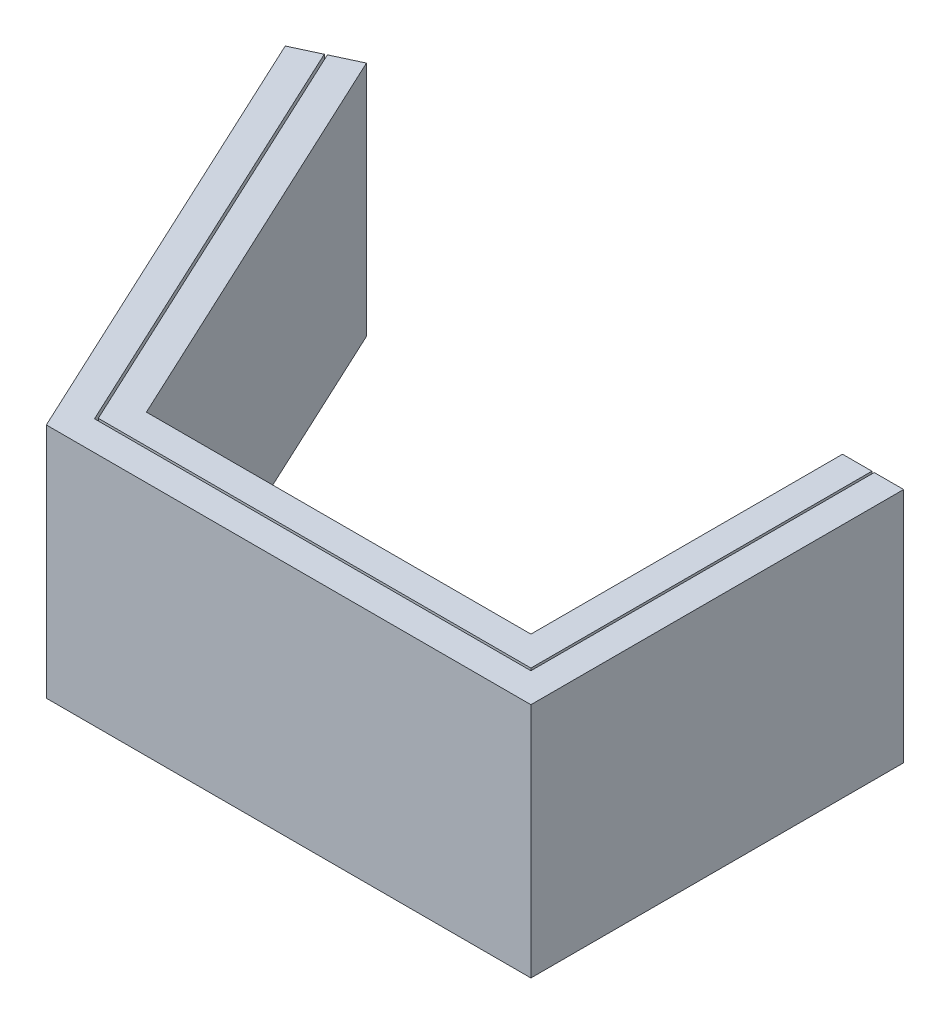
ISO-10303-21;
HEADER;
FILE_DESCRIPTION(('STEP AP214'),'2;1');
FILE_NAME('part.step','',(''),(''),'','','');
FILE_SCHEMA(('AUTOMOTIVE_DESIGN { 1 0 10303 214 1 1 1 1 }'));
ENDSEC;
DATA;
#1=APPLICATION_CONTEXT('core data for automotive mechanical design processes');
#2=APPLICATION_PROTOCOL_DEFINITION('international standard','automotive_design',2000,#1);
#3=PRODUCT_CONTEXT('',#1,'mechanical');
#4=PRODUCT('Part','Part','',(#3));
#5=PRODUCT_RELATED_PRODUCT_CATEGORY('part','',(#4));
#6=PRODUCT_DEFINITION_FORMATION('','',#4);
#7=PRODUCT_DEFINITION_CONTEXT('part definition',#1,'design');
#8=PRODUCT_DEFINITION('design','',#6,#7);
#9=PRODUCT_DEFINITION_SHAPE('','',#8);
#10=(LENGTH_UNIT() NAMED_UNIT(*) SI_UNIT(.MILLI.,.METRE.));
#11=(NAMED_UNIT(*) PLANE_ANGLE_UNIT() SI_UNIT($,.RADIAN.));
#12=(NAMED_UNIT(*) SI_UNIT($,.STERADIAN.) SOLID_ANGLE_UNIT());
#13=UNCERTAINTY_MEASURE_WITH_UNIT(LENGTH_MEASURE(1.E-05),#10,'distance_accuracy_value','');
#14=(GEOMETRIC_REPRESENTATION_CONTEXT(3) GLOBAL_UNCERTAINTY_ASSIGNED_CONTEXT((#13)) GLOBAL_UNIT_ASSIGNED_CONTEXT((#10,
#11,#12)) REPRESENTATION_CONTEXT('',''));
#15=CARTESIAN_POINT('',(0.,0.,0.));
#16=DIRECTION('',(0.,0.,1.));
#17=DIRECTION('',(1.,0.,0.));
#18=AXIS2_PLACEMENT_3D('',#15,#16,#17);
#19=CARTESIAN_POINT('',(-142.625579714794,0.,-98.9466557883392));
#20=DIRECTION('',(-0.422618261740698,0.,-0.906307787036651));
#21=DIRECTION('',(-0.906307787036651,0.,0.422618261740698));
#22=AXIS2_PLACEMENT_3D('',#19,#20,#21);
#23=PLANE('',#22);
#24=DIRECTION('',(-0.906307787036651,0.,0.422618261740698));
#25=VECTOR('',#24,1.);
#26=CARTESIAN_POINT('',(-142.625579714794,50.8,-98.9466557883392));
#27=LINE('',#26,#25);
#28=CARTESIAN_POINT('',(-136.906777578593,50.8,-101.613377019923));
#29=VERTEX_POINT('',#28);
#30=CARTESIAN_POINT('',(-142.625579714794,50.8,-98.9466557883392));
#31=VERTEX_POINT('',#30);
#32=EDGE_CURVE('E148',#29,#31,#27,.T.);
#33=ORIENTED_EDGE('',*,*,#32,.F.);
#34=DIRECTION('',(0.,1.,0.));
#35=VECTOR('',#34,1.);
#36=CARTESIAN_POINT('',(-136.906777578593,0.,-101.613377019923));
#37=LINE('',#36,#35);
#38=CARTESIAN_POINT('',(-136.906777578593,0.,-101.613377019923));
#39=VERTEX_POINT('',#38);
#40=EDGE_CURVE('E13',#39,#29,#37,.T.);
#41=ORIENTED_EDGE('',*,*,#40,.F.);
#42=DIRECTION('',(-0.906307787036651,0.,0.422618261740698));
#43=VECTOR('',#42,1.);
#44=CARTESIAN_POINT('',(-142.625579714794,0.,-98.9466557883392));
#45=LINE('',#44,#43);
#46=CARTESIAN_POINT('',(-142.625579714794,0.,-98.9466557883392));
#47=VERTEX_POINT('',#46);
#48=EDGE_CURVE('E186',#39,#47,#45,.T.);
#49=ORIENTED_EDGE('',*,*,#48,.T.);
#50=DIRECTION('',(0.,1.,0.));
#51=VECTOR('',#50,1.);
#52=CARTESIAN_POINT('',(-142.625579714794,0.,-98.9466557883392));
#53=LINE('',#52,#51);
#54=EDGE_CURVE('E54',#47,#31,#53,.T.);
#55=ORIENTED_EDGE('',*,*,#54,.T.);
#56=EDGE_LOOP('',(#33,#41,#49,#55));
#57=FACE_BOUND('',#56,.T.);
#58=ADVANCED_FACE('F51',(#57),#23,.T.);
#59=CARTESIAN_POINT('',(-136.906777578593,0.,-101.613377019923));
#60=DIRECTION('',(0.906307787036651,0.,-0.422618261740697));
#61=DIRECTION('',(-0.422618261740697,0.,-0.906307787036651));
#62=AXIS2_PLACEMENT_3D('',#59,#60,#61);
#63=PLANE('',#62);
#64=DIRECTION('',(-0.422618261740697,0.,-0.906307787036651));
#65=VECTOR('',#64,1.);
#66=CARTESIAN_POINT('',(-136.906777578593,50.8,-101.613377019923));
#67=LINE('',#66,#65);
#68=CARTESIAN_POINT('',(-95.6416381782056,50.8,-13.12));
#69=VERTEX_POINT('',#68);
#70=EDGE_CURVE('E182',#69,#29,#67,.T.);
#71=ORIENTED_EDGE('',*,*,#70,.F.);
#72=DIRECTION('',(0.,1.,0.));
#73=VECTOR('',#72,1.);
#74=CARTESIAN_POINT('',(-95.6416381782056,0.,-13.12));
#75=LINE('',#74,#73);
#76=CARTESIAN_POINT('',(-95.6416381782056,0.,-13.12));
#77=VERTEX_POINT('',#76);
#78=EDGE_CURVE('E60',#77,#69,#75,.T.);
#79=ORIENTED_EDGE('',*,*,#78,.F.);
#80=DIRECTION('',(-0.422618261740697,0.,-0.906307787036651));
#81=VECTOR('',#80,1.);
#82=CARTESIAN_POINT('',(-136.906777578593,0.,-101.613377019923));
#83=LINE('',#82,#81);
#84=EDGE_CURVE('E138',#77,#39,#83,.T.);
#85=ORIENTED_EDGE('',*,*,#84,.T.);
#86=ORIENTED_EDGE('',*,*,#40,.T.);
#87=EDGE_LOOP('',(#71,#79,#85,#86));
#88=FACE_BOUND('',#87,.T.);
#89=ADVANCED_FACE('F200',(#88),#63,.T.);
#90=CARTESIAN_POINT('',(-95.6416381782056,0.,-13.12));
#91=DIRECTION('',(0.,0.,-1.));
#92=DIRECTION('',(-1.,0.,0.));
#93=AXIS2_PLACEMENT_3D('',#90,#91,#92);
#94=PLANE('',#93);
#95=DIRECTION('',(-1.,0.,0.));
#96=VECTOR('',#95,1.);
#97=CARTESIAN_POINT('',(-95.6416381782056,50.8,-13.12));
#98=LINE('',#97,#96);
#99=CARTESIAN_POINT('',(-13.12,50.8,-13.12));
#100=VERTEX_POINT('',#99);
#101=EDGE_CURVE('E125',#100,#69,#98,.T.);
#102=ORIENTED_EDGE('',*,*,#101,.F.);
#103=DIRECTION('',(0.,1.,0.));
#104=VECTOR('',#103,1.);
#105=CARTESIAN_POINT('',(-13.12,0.,-13.12));
#106=LINE('',#105,#104);
#107=CARTESIAN_POINT('',(-13.12,0.,-13.12));
#108=VERTEX_POINT('',#107);
#109=EDGE_CURVE('E120',#108,#100,#106,.T.);
#110=ORIENTED_EDGE('',*,*,#109,.F.);
#111=DIRECTION('',(-1.,0.,0.));
#112=VECTOR('',#111,1.);
#113=CARTESIAN_POINT('',(-95.6416381782056,0.,-13.12));
#114=LINE('',#113,#112);
#115=EDGE_CURVE('E123',#108,#77,#114,.T.);
#116=ORIENTED_EDGE('',*,*,#115,.T.);
#117=ORIENTED_EDGE('',*,*,#78,.T.);
#118=EDGE_LOOP('',(#102,#110,#116,#117));
#119=FACE_BOUND('',#118,.T.);
#120=ADVANCED_FACE('F122',(#119),#94,.T.);
#121=CARTESIAN_POINT('',(-13.12,0.,-13.12));
#122=DIRECTION('',(-1.,0.,0.));
#123=DIRECTION('',(0.,0.,1.));
#124=AXIS2_PLACEMENT_3D('',#121,#122,#123);
#125=PLANE('',#124);
#126=DIRECTION('',(0.,0.,1.));
#127=VECTOR('',#126,1.);
#128=CARTESIAN_POINT('',(-13.12,50.8,-13.12));
#129=LINE('',#128,#127);
#130=CARTESIAN_POINT('',(-13.12,50.8,-80.));
#131=VERTEX_POINT('',#130);
#132=EDGE_CURVE('E176',#131,#100,#129,.T.);
#133=ORIENTED_EDGE('',*,*,#132,.F.);
#134=DIRECTION('',(0.,1.,0.));
#135=VECTOR('',#134,1.);
#136=CARTESIAN_POINT('',(-13.12,0.,-80.));
#137=LINE('',#136,#135);
#138=CARTESIAN_POINT('',(-13.12,0.,-80.));
#139=VERTEX_POINT('',#138);
#140=EDGE_CURVE('E130',#139,#131,#137,.T.);
#141=ORIENTED_EDGE('',*,*,#140,.F.);
#142=DIRECTION('',(0.,0.,1.));
#143=VECTOR('',#142,1.);
#144=CARTESIAN_POINT('',(-13.12,0.,-13.12));
#145=LINE('',#144,#143);
#146=EDGE_CURVE('E136',#139,#108,#145,.T.);
#147=ORIENTED_EDGE('',*,*,#146,.T.);
#148=ORIENTED_EDGE('',*,*,#109,.T.);
#149=EDGE_LOOP('',(#133,#141,#147,#148));
#150=FACE_BOUND('',#149,.T.);
#151=ADVANCED_FACE('F140',(#150),#125,.T.);
#152=CARTESIAN_POINT('',(-13.12,0.,-80.));
#153=DIRECTION('',(0.,0.,-1.));
#154=DIRECTION('',(-1.,0.,0.));
#155=AXIS2_PLACEMENT_3D('',#152,#153,#154);
#156=PLANE('',#155);
#157=DIRECTION('',(-1.,0.,0.));
#158=VECTOR('',#157,1.);
#159=CARTESIAN_POINT('',(-13.12,50.8,-80.));
#160=LINE('',#159,#158);
#161=CARTESIAN_POINT('',(-6.81,50.8,-80.));
#162=VERTEX_POINT('',#161);
#163=EDGE_CURVE('E171',#162,#131,#160,.T.);
#164=ORIENTED_EDGE('',*,*,#163,.F.);
#165=DIRECTION('',(0.,1.,0.));
#166=VECTOR('',#165,1.);
#167=CARTESIAN_POINT('',(-6.81,0.,-80.));
#168=LINE('',#167,#166);
#169=CARTESIAN_POINT('',(-6.81,0.,-80.));
#170=VERTEX_POINT('',#169);
#171=EDGE_CURVE('E190',#170,#162,#168,.T.);
#172=ORIENTED_EDGE('',*,*,#171,.F.);
#173=DIRECTION('',(-1.,0.,0.));
#174=VECTOR('',#173,1.);
#175=CARTESIAN_POINT('',(-13.12,0.,-80.));
#176=LINE('',#175,#174);
#177=EDGE_CURVE('E141',#170,#139,#176,.T.);
#178=ORIENTED_EDGE('',*,*,#177,.T.);
#179=ORIENTED_EDGE('',*,*,#140,.T.);
#180=EDGE_LOOP('',(#164,#172,#178,#179));
#181=FACE_BOUND('',#180,.T.);
#182=ADVANCED_FACE('F213',(#181),#156,.T.);
#183=CARTESIAN_POINT('',(-6.81,0.,-6.80999999999999));
#184=DIRECTION('',(1.,0.,0.));
#185=DIRECTION('',(0.,0.,-1.));
#186=AXIS2_PLACEMENT_3D('',#183,#184,#185);
#187=PLANE('',#186);
#188=DIRECTION('',(0.,0.,-1.));
#189=VECTOR('',#188,1.);
#190=CARTESIAN_POINT('',(-6.81,50.8,-6.80999999999999));
#191=LINE('',#190,#189);
#192=CARTESIAN_POINT('',(-6.81,50.8,-6.80999999999999));
#193=VERTEX_POINT('',#192);
#194=EDGE_CURVE('E166',#193,#162,#191,.T.);
#195=ORIENTED_EDGE('',*,*,#194,.F.);
#196=DIRECTION('',(0.,1.,0.));
#197=VECTOR('',#196,1.);
#198=CARTESIAN_POINT('',(-6.81,0.,-6.80999999999999));
#199=LINE('',#198,#197);
#200=CARTESIAN_POINT('',(-6.81,0.,-6.80999999999999));
#201=VERTEX_POINT('',#200);
#202=EDGE_CURVE('E192',#201,#193,#199,.T.);
#203=ORIENTED_EDGE('',*,*,#202,.F.);
#204=DIRECTION('',(0.,0.,-1.));
#205=VECTOR('',#204,1.);
#206=CARTESIAN_POINT('',(-6.81,0.,-6.80999999999999));
#207=LINE('',#206,#205);
#208=EDGE_CURVE('E143',#201,#170,#207,.T.);
#209=ORIENTED_EDGE('',*,*,#208,.T.);
#210=ORIENTED_EDGE('',*,*,#171,.T.);
#211=EDGE_LOOP('',(#195,#203,#209,#210));
#212=FACE_BOUND('',#211,.T.);
#213=ADVANCED_FACE('F216',(#212),#187,.T.);
#214=CARTESIAN_POINT('',(-99.6615515239009,0.,-6.80999999999999));
#215=DIRECTION('',(0.,0.,1.));
#216=DIRECTION('',(1.,0.,0.));
#217=AXIS2_PLACEMENT_3D('',#214,#215,#216);
#218=PLANE('',#217);
#219=DIRECTION('',(1.,0.,0.));
#220=VECTOR('',#219,1.);
#221=CARTESIAN_POINT('',(-99.6615515239009,50.8,-6.80999999999999));
#222=LINE('',#221,#220);
#223=CARTESIAN_POINT('',(-99.6615515239009,50.8,-6.80999999999999));
#224=VERTEX_POINT('',#223);
#225=EDGE_CURVE('E162',#224,#193,#222,.T.);
#226=ORIENTED_EDGE('',*,*,#225,.F.);
#227=DIRECTION('',(0.,1.,0.));
#228=VECTOR('',#227,1.);
#229=CARTESIAN_POINT('',(-99.6615515239009,0.,-6.80999999999999));
#230=LINE('',#229,#228);
#231=CARTESIAN_POINT('',(-99.6615515239009,0.,-6.80999999999999));
#232=VERTEX_POINT('',#231);
#233=EDGE_CURVE('E193',#232,#224,#230,.T.);
#234=ORIENTED_EDGE('',*,*,#233,.F.);
#235=DIRECTION('',(1.,0.,0.));
#236=VECTOR('',#235,1.);
#237=CARTESIAN_POINT('',(-99.6615515239009,0.,-6.80999999999999));
#238=LINE('',#237,#236);
#239=EDGE_CURVE('E292',#232,#201,#238,.T.);
#240=ORIENTED_EDGE('',*,*,#239,.T.);
#241=ORIENTED_EDGE('',*,*,#202,.T.);
#242=EDGE_LOOP('',(#226,#234,#240,#241));
#243=FACE_BOUND('',#242,.T.);
#244=ADVANCED_FACE('F220',(#243),#218,.T.);
#245=CARTESIAN_POINT('',(-142.625579714794,0.,-98.9466557883392));
#246=DIRECTION('',(-0.906307787036651,0.,0.422618261740697));
#247=DIRECTION('',(0.422618261740697,0.,0.906307787036651));
#248=AXIS2_PLACEMENT_3D('',#245,#246,#247);
#249=PLANE('',#248);
#250=DIRECTION('',(0.422618261740697,0.,0.906307787036651));
#251=VECTOR('',#250,1.);
#252=CARTESIAN_POINT('',(-142.625579714794,50.8,-98.9466557883392));
#253=LINE('',#252,#251);
#254=EDGE_CURVE('E153',#31,#224,#253,.T.);
#255=ORIENTED_EDGE('',*,*,#254,.F.);
#256=ORIENTED_EDGE('',*,*,#54,.F.);
#257=DIRECTION('',(0.422618261740697,0.,0.906307787036651));
#258=VECTOR('',#257,1.);
#259=CARTESIAN_POINT('',(-142.625579714794,0.,-98.9466557883392));
#260=LINE('',#259,#258);
#261=EDGE_CURVE('E293',#47,#232,#260,.T.);
#262=ORIENTED_EDGE('',*,*,#261,.T.);
#263=ORIENTED_EDGE('',*,*,#233,.T.);
#264=EDGE_LOOP('',(#255,#256,#262,#263));
#265=FACE_BOUND('',#264,.T.);
#266=ADVANCED_FACE('F196',(#265),#249,.T.);
#267=CARTESIAN_POINT('',(0.,0.,0.));
#268=DIRECTION('',(0.,-1.,0.));
#269=DIRECTION('',(0.,0.,-1.));
#270=AXIS2_PLACEMENT_3D('',#267,#268,#269);
#271=PLANE('',#270);
#272=ORIENTED_EDGE('',*,*,#48,.F.);
#273=ORIENTED_EDGE('',*,*,#84,.F.);
#274=ORIENTED_EDGE('',*,*,#115,.F.);
#275=ORIENTED_EDGE('',*,*,#146,.F.);
#276=ORIENTED_EDGE('',*,*,#177,.F.);
#277=ORIENTED_EDGE('',*,*,#208,.F.);
#278=ORIENTED_EDGE('',*,*,#239,.F.);
#279=ORIENTED_EDGE('',*,*,#261,.F.);
#280=EDGE_LOOP('',(#272,#273,#274,#275,#276,#277,#278,#279));
#281=FACE_BOUND('',#280,.T.);
#282=ADVANCED_FACE('F134',(#281),#271,.T.);
#283=CARTESIAN_POINT('',(0.,50.8,0.));
#284=DIRECTION('',(0.,-1.,0.));
#285=DIRECTION('',(0.,0.,-1.));
#286=AXIS2_PLACEMENT_3D('',#283,#284,#285);
#287=PLANE('',#286);
#288=ORIENTED_EDGE('',*,*,#32,.T.);
#289=ORIENTED_EDGE('',*,*,#254,.T.);
#290=ORIENTED_EDGE('',*,*,#225,.T.);
#291=ORIENTED_EDGE('',*,*,#194,.T.);
#292=ORIENTED_EDGE('',*,*,#163,.T.);
#293=ORIENTED_EDGE('',*,*,#132,.T.);
#294=ORIENTED_EDGE('',*,*,#101,.T.);
#295=ORIENTED_EDGE('',*,*,#70,.T.);
#296=EDGE_LOOP('',(#288,#289,#290,#291,#292,#293,#294,#295));
#297=FACE_BOUND('',#296,.T.);
#298=ADVANCED_FACE('F199',(#297),#287,.F.);
#299=CLOSED_SHELL('',(#58,#89,#120,#151,#182,#213,#244,#266,#282,#298));
#300=MANIFOLD_SOLID_BREP('B2',#299);
#301=CARTESIAN_POINT('',(0.,50.8,0.));
#302=DIRECTION('',(-1.,0.,0.));
#303=DIRECTION('',(0.,0.,1.));
#304=AXIS2_PLACEMENT_3D('',#301,#302,#303);
#305=PLANE('',#304);
#306=DIRECTION('',(0.,0.,-1.));
#307=VECTOR('',#306,1.);
#308=CARTESIAN_POINT('',(0.,0.,0.));
#309=LINE('',#308,#307);
#310=CARTESIAN_POINT('',(0.,0.,0.));
#311=VERTEX_POINT('',#310);
#312=CARTESIAN_POINT('',(0.,0.,-80.));
#313=VERTEX_POINT('',#312);
#314=EDGE_CURVE('E457',#311,#313,#309,.T.);
#315=ORIENTED_EDGE('',*,*,#314,.T.);
#316=DIRECTION('',(0.,-1.,0.));
#317=VECTOR('',#316,1.);
#318=CARTESIAN_POINT('',(0.,50.8,-80.));
#319=LINE('',#318,#317);
#320=CARTESIAN_POINT('',(0.,50.8,-80.));
#321=VERTEX_POINT('',#320);
#322=EDGE_CURVE('E49',#321,#313,#319,.T.);
#323=ORIENTED_EDGE('',*,*,#322,.F.);
#324=DIRECTION('',(0.,0.,-1.));
#325=VECTOR('',#324,1.);
#326=CARTESIAN_POINT('',(0.,50.8,0.));
#327=LINE('',#326,#325);
#328=CARTESIAN_POINT('',(0.,50.8,0.));
#329=VERTEX_POINT('',#328);
#330=EDGE_CURVE('E422',#329,#321,#327,.T.);
#331=ORIENTED_EDGE('',*,*,#330,.F.);
#332=DIRECTION('',(0.,-1.,0.));
#333=VECTOR('',#332,1.);
#334=CARTESIAN_POINT('',(0.,50.8,0.));
#335=LINE('',#334,#333);
#336=EDGE_CURVE('E397',#329,#311,#335,.T.);
#337=ORIENTED_EDGE('',*,*,#336,.T.);
#338=EDGE_LOOP('',(#315,#323,#331,#337));
#339=FACE_BOUND('',#338,.T.);
#340=ADVANCED_FACE('F302',(#339),#305,.F.);
#341=CARTESIAN_POINT('',(-6.31,50.8,-80.));
#342=DIRECTION('',(0.,0.,1.));
#343=DIRECTION('',(1.,0.,0.));
#344=AXIS2_PLACEMENT_3D('',#341,#342,#343);
#345=PLANE('',#344);
#346=DIRECTION('',(-1.,0.,0.));
#347=VECTOR('',#346,1.);
#348=CARTESIAN_POINT('',(-6.31,0.,-80.));
#349=LINE('',#348,#347);
#350=CARTESIAN_POINT('',(-6.31,0.,-80.));
#351=VERTEX_POINT('',#350);
#352=EDGE_CURVE('E451',#313,#351,#349,.T.);
#353=ORIENTED_EDGE('',*,*,#352,.T.);
#354=DIRECTION('',(0.,-1.,0.));
#355=VECTOR('',#354,1.);
#356=CARTESIAN_POINT('',(-6.31,50.8,-80.));
#357=LINE('',#356,#355);
#358=CARTESIAN_POINT('',(-6.31,50.8,-80.));
#359=VERTEX_POINT('',#358);
#360=EDGE_CURVE('E310',#359,#351,#357,.T.);
#361=ORIENTED_EDGE('',*,*,#360,.F.);
#362=DIRECTION('',(-1.,0.,0.));
#363=VECTOR('',#362,1.);
#364=CARTESIAN_POINT('',(-6.31,50.8,-80.));
#365=LINE('',#364,#363);
#366=EDGE_CURVE('E361',#321,#359,#365,.T.);
#367=ORIENTED_EDGE('',*,*,#366,.F.);
#368=ORIENTED_EDGE('',*,*,#322,.T.);
#369=EDGE_LOOP('',(#353,#361,#367,#368));
#370=FACE_BOUND('',#369,.T.);
#371=ADVANCED_FACE('F476',(#370),#345,.F.);
#372=CARTESIAN_POINT('',(-6.31,50.8,-6.31));
#373=DIRECTION('',(1.,0.,0.));
#374=DIRECTION('',(0.,0.,-1.));
#375=AXIS2_PLACEMENT_3D('',#372,#373,#374);
#376=PLANE('',#375);
#377=DIRECTION('',(0.,0.,1.));
#378=VECTOR('',#377,1.);
#379=CARTESIAN_POINT('',(-6.31,0.,-6.31));
#380=LINE('',#379,#378);
#381=CARTESIAN_POINT('',(-6.31,0.,-6.31));
#382=VERTEX_POINT('',#381);
#383=EDGE_CURVE('E446',#351,#382,#380,.T.);
#384=ORIENTED_EDGE('',*,*,#383,.T.);
#385=DIRECTION('',(0.,-1.,0.));
#386=VECTOR('',#385,1.);
#387=CARTESIAN_POINT('',(-6.31,50.8,-6.31));
#388=LINE('',#387,#386);
#389=CARTESIAN_POINT('',(-6.31,50.8,-6.31));
#390=VERTEX_POINT('',#389);
#391=EDGE_CURVE('E438',#390,#382,#388,.T.);
#392=ORIENTED_EDGE('',*,*,#391,.F.);
#393=DIRECTION('',(0.,0.,1.));
#394=VECTOR('',#393,1.);
#395=CARTESIAN_POINT('',(-6.31,50.8,-6.31));
#396=LINE('',#395,#394);
#397=EDGE_CURVE('E414',#359,#390,#396,.T.);
#398=ORIENTED_EDGE('',*,*,#397,.F.);
#399=ORIENTED_EDGE('',*,*,#360,.T.);
#400=EDGE_LOOP('',(#384,#392,#398,#399));
#401=FACE_BOUND('',#400,.T.);
#402=ADVANCED_FACE('F444',(#401),#376,.F.);
#403=CARTESIAN_POINT('',(-6.31,50.8,-6.31));
#404=DIRECTION('',(0.,0.,1.));
#405=DIRECTION('',(1.,0.,0.));
#406=AXIS2_PLACEMENT_3D('',#403,#404,#405);
#407=PLANE('',#406);
#408=DIRECTION('',(-1.,0.,0.));
#409=VECTOR('',#408,1.);
#410=CARTESIAN_POINT('',(-6.31,0.,-6.31));
#411=LINE('',#410,#409);
#412=CARTESIAN_POINT('',(-99.9800866543047,0.,-6.30999999999999));
#413=VERTEX_POINT('',#412);
#414=EDGE_CURVE('E453',#382,#413,#411,.T.);
#415=ORIENTED_EDGE('',*,*,#414,.T.);
#416=DIRECTION('',(0.,-1.,0.));
#417=VECTOR('',#416,1.);
#418=CARTESIAN_POINT('',(-99.9800866543047,50.8,-6.30999999999999));
#419=LINE('',#418,#417);
#420=CARTESIAN_POINT('',(-99.9800866543047,50.8,-6.30999999999999));
#421=VERTEX_POINT('',#420);
#422=EDGE_CURVE('E435',#421,#413,#419,.T.);
#423=ORIENTED_EDGE('',*,*,#422,.F.);
#424=DIRECTION('',(-1.,0.,0.));
#425=VECTOR('',#424,1.);
#426=CARTESIAN_POINT('',(-6.31,50.8,-6.31));
#427=LINE('',#426,#425);
#428=EDGE_CURVE('E410',#390,#421,#427,.T.);
#429=ORIENTED_EDGE('',*,*,#428,.F.);
#430=ORIENTED_EDGE('',*,*,#391,.T.);
#431=EDGE_LOOP('',(#415,#423,#429,#430));
#432=FACE_BOUND('',#431,.T.);
#433=ADVANCED_FACE('F483',(#432),#407,.F.);
#434=CARTESIAN_POINT('',(-99.9800866543047,50.8,-6.30999999999999));
#435=DIRECTION('',(-0.906307787036651,0.,0.422618261740697));
#436=DIRECTION('',(0.422618261740697,0.,0.906307787036651));
#437=AXIS2_PLACEMENT_3D('',#434,#435,#436);
#438=PLANE('',#437);
#439=DIRECTION('',(-0.422618261740697,0.,-0.906307787036651));
#440=VECTOR('',#439,1.);
#441=CARTESIAN_POINT('',(-99.9800866543047,0.,-6.30999999999999));
#442=LINE('',#441,#440);
#443=CARTESIAN_POINT('',(-143.078733608313,0.,-98.7353466574688));
#444=VERTEX_POINT('',#443);
#445=EDGE_CURVE('E455',#413,#444,#442,.T.);
#446=ORIENTED_EDGE('',*,*,#445,.T.);
#447=DIRECTION('',(0.,-1.,0.));
#448=VECTOR('',#447,1.);
#449=CARTESIAN_POINT('',(-143.078733608313,50.8,-98.7353466574688));
#450=LINE('',#449,#448);
#451=CARTESIAN_POINT('',(-143.078733608313,50.8,-98.7353466574688));
#452=VERTEX_POINT('',#451);
#453=EDGE_CURVE('E390',#452,#444,#450,.T.);
#454=ORIENTED_EDGE('',*,*,#453,.F.);
#455=DIRECTION('',(-0.422618261740697,0.,-0.906307787036651));
#456=VECTOR('',#455,1.);
#457=CARTESIAN_POINT('',(-99.9800866543047,50.8,-6.30999999999999));
#458=LINE('',#457,#456);
#459=EDGE_CURVE('E380',#421,#452,#458,.T.);
#460=ORIENTED_EDGE('',*,*,#459,.F.);
#461=ORIENTED_EDGE('',*,*,#422,.T.);
#462=EDGE_LOOP('',(#446,#454,#460,#461));
#463=FACE_BOUND('',#462,.T.);
#464=ADVANCED_FACE('F461',(#463),#438,.F.);
#465=CARTESIAN_POINT('',(-143.078733608313,50.8,-98.7353466574688));
#466=DIRECTION('',(0.422618261740698,0.,0.906307787036651));
#467=DIRECTION('',(0.906307787036651,0.,-0.422618261740698));
#468=AXIS2_PLACEMENT_3D('',#465,#466,#467);
#469=PLANE('',#468);
#470=DIRECTION('',(-0.906307787036651,0.,0.422618261740698));
#471=VECTOR('',#470,1.);
#472=CARTESIAN_POINT('',(-143.078733608313,0.,-98.7353466574688));
#473=LINE('',#472,#471);
#474=CARTESIAN_POINT('',(-148.797535744514,0.,-96.068625425885));
#475=VERTEX_POINT('',#474);
#476=EDGE_CURVE('E389',#444,#475,#473,.T.);
#477=ORIENTED_EDGE('',*,*,#476,.T.);
#478=DIRECTION('',(0.,-1.,0.));
#479=VECTOR('',#478,1.);
#480=CARTESIAN_POINT('',(-148.797535744514,50.8,-96.068625425885));
#481=LINE('',#480,#479);
#482=CARTESIAN_POINT('',(-148.797535744514,50.8,-96.068625425885));
#483=VERTEX_POINT('',#482);
#484=EDGE_CURVE('E386',#483,#475,#481,.T.);
#485=ORIENTED_EDGE('',*,*,#484,.F.);
#486=DIRECTION('',(-0.906307787036651,0.,0.422618261740698));
#487=VECTOR('',#486,1.);
#488=CARTESIAN_POINT('',(-143.078733608313,50.8,-98.7353466574688));
#489=LINE('',#488,#487);
#490=EDGE_CURVE('E374',#452,#483,#489,.T.);
#491=ORIENTED_EDGE('',*,*,#490,.F.);
#492=ORIENTED_EDGE('',*,*,#453,.T.);
#493=EDGE_LOOP('',(#477,#485,#491,#492));
#494=FACE_BOUND('',#493,.T.);
#495=ADVANCED_FACE('F387',(#494),#469,.F.);
#496=CARTESIAN_POINT('',(-104.,50.8,0.));
#497=DIRECTION('',(0.906307787036651,0.,-0.422618261740697));
#498=DIRECTION('',(-0.422618261740697,0.,-0.906307787036651));
#499=AXIS2_PLACEMENT_3D('',#496,#497,#498);
#500=PLANE('',#499);
#501=DIRECTION('',(0.422618261740697,0.,0.906307787036651));
#502=VECTOR('',#501,1.);
#503=CARTESIAN_POINT('',(-104.,0.,0.));
#504=LINE('',#503,#502);
#505=CARTESIAN_POINT('',(-104.,0.,0.));
#506=VERTEX_POINT('',#505);
#507=EDGE_CURVE('E347',#475,#506,#504,.T.);
#508=ORIENTED_EDGE('',*,*,#507,.T.);
#509=DIRECTION('',(0.,-1.,0.));
#510=VECTOR('',#509,1.);
#511=CARTESIAN_POINT('',(-104.,50.8,0.));
#512=LINE('',#511,#510);
#513=CARTESIAN_POINT('',(-104.,50.8,0.));
#514=VERTEX_POINT('',#513);
#515=EDGE_CURVE('E391',#514,#506,#512,.T.);
#516=ORIENTED_EDGE('',*,*,#515,.F.);
#517=DIRECTION('',(0.422618261740697,0.,0.906307787036651));
#518=VECTOR('',#517,1.);
#519=CARTESIAN_POINT('',(-104.,50.8,0.));
#520=LINE('',#519,#518);
#521=EDGE_CURVE('E378',#483,#514,#520,.T.);
#522=ORIENTED_EDGE('',*,*,#521,.F.);
#523=ORIENTED_EDGE('',*,*,#484,.T.);
#524=EDGE_LOOP('',(#508,#516,#522,#523));
#525=FACE_BOUND('',#524,.T.);
#526=ADVANCED_FACE('F393',(#525),#500,.F.);
#527=CARTESIAN_POINT('',(0.,50.8,0.));
#528=DIRECTION('',(0.,0.,-1.));
#529=DIRECTION('',(-1.,0.,0.));
#530=AXIS2_PLACEMENT_3D('',#527,#528,#529);
#531=PLANE('',#530);
#532=DIRECTION('',(1.,0.,0.));
#533=VECTOR('',#532,1.);
#534=CARTESIAN_POINT('',(0.,0.,0.));
#535=LINE('',#534,#533);
#536=EDGE_CURVE('E353',#506,#311,#535,.T.);
#537=ORIENTED_EDGE('',*,*,#536,.T.);
#538=ORIENTED_EDGE('',*,*,#336,.F.);
#539=DIRECTION('',(1.,0.,0.));
#540=VECTOR('',#539,1.);
#541=CARTESIAN_POINT('',(0.,50.8,0.));
#542=LINE('',#541,#540);
#543=EDGE_CURVE('E318',#514,#329,#542,.T.);
#544=ORIENTED_EDGE('',*,*,#543,.F.);
#545=ORIENTED_EDGE('',*,*,#515,.T.);
#546=EDGE_LOOP('',(#537,#538,#544,#545));
#547=FACE_BOUND('',#546,.T.);
#548=ADVANCED_FACE('F465',(#547),#531,.F.);
#549=CARTESIAN_POINT('',(0.,50.8,0.));
#550=DIRECTION('',(0.,-1.,0.));
#551=DIRECTION('',(0.,0.,-1.));
#552=AXIS2_PLACEMENT_3D('',#549,#550,#551);
#553=PLANE('',#552);
#554=ORIENTED_EDGE('',*,*,#330,.T.);
#555=ORIENTED_EDGE('',*,*,#366,.T.);
#556=ORIENTED_EDGE('',*,*,#397,.T.);
#557=ORIENTED_EDGE('',*,*,#428,.T.);
#558=ORIENTED_EDGE('',*,*,#459,.T.);
#559=ORIENTED_EDGE('',*,*,#490,.T.);
#560=ORIENTED_EDGE('',*,*,#521,.T.);
#561=ORIENTED_EDGE('',*,*,#543,.T.);
#562=EDGE_LOOP('',(#554,#555,#556,#557,#558,#559,#560,#561));
#563=FACE_BOUND('',#562,.T.);
#564=ADVANCED_FACE('F376',(#563),#553,.F.);
#565=CARTESIAN_POINT('',(0.,0.,0.));
#566=DIRECTION('',(0.,-1.,0.));
#567=DIRECTION('',(0.,0.,-1.));
#568=AXIS2_PLACEMENT_3D('',#565,#566,#567);
#569=PLANE('',#568);
#570=ORIENTED_EDGE('',*,*,#314,.F.);
#571=ORIENTED_EDGE('',*,*,#536,.F.);
#572=ORIENTED_EDGE('',*,*,#507,.F.);
#573=ORIENTED_EDGE('',*,*,#476,.F.);
#574=ORIENTED_EDGE('',*,*,#445,.F.);
#575=ORIENTED_EDGE('',*,*,#414,.F.);
#576=ORIENTED_EDGE('',*,*,#383,.F.);
#577=ORIENTED_EDGE('',*,*,#352,.F.);
#578=EDGE_LOOP('',(#570,#571,#572,#573,#574,#575,#576,#577));
#579=FACE_BOUND('',#578,.T.);
#580=ADVANCED_FACE('F450',(#579),#569,.T.);
#581=CLOSED_SHELL('',(#340,#371,#402,#433,#464,#495,#526,#548,#564,#580));
#582=MANIFOLD_SOLID_BREP('B7',#581);
#583=ADVANCED_BREP_SHAPE_REPRESENTATION('',(#18,#300,#582),#14);
#584=SHAPE_DEFINITION_REPRESENTATION(#9,#583);
ENDSEC;
END-ISO-10303-21;
